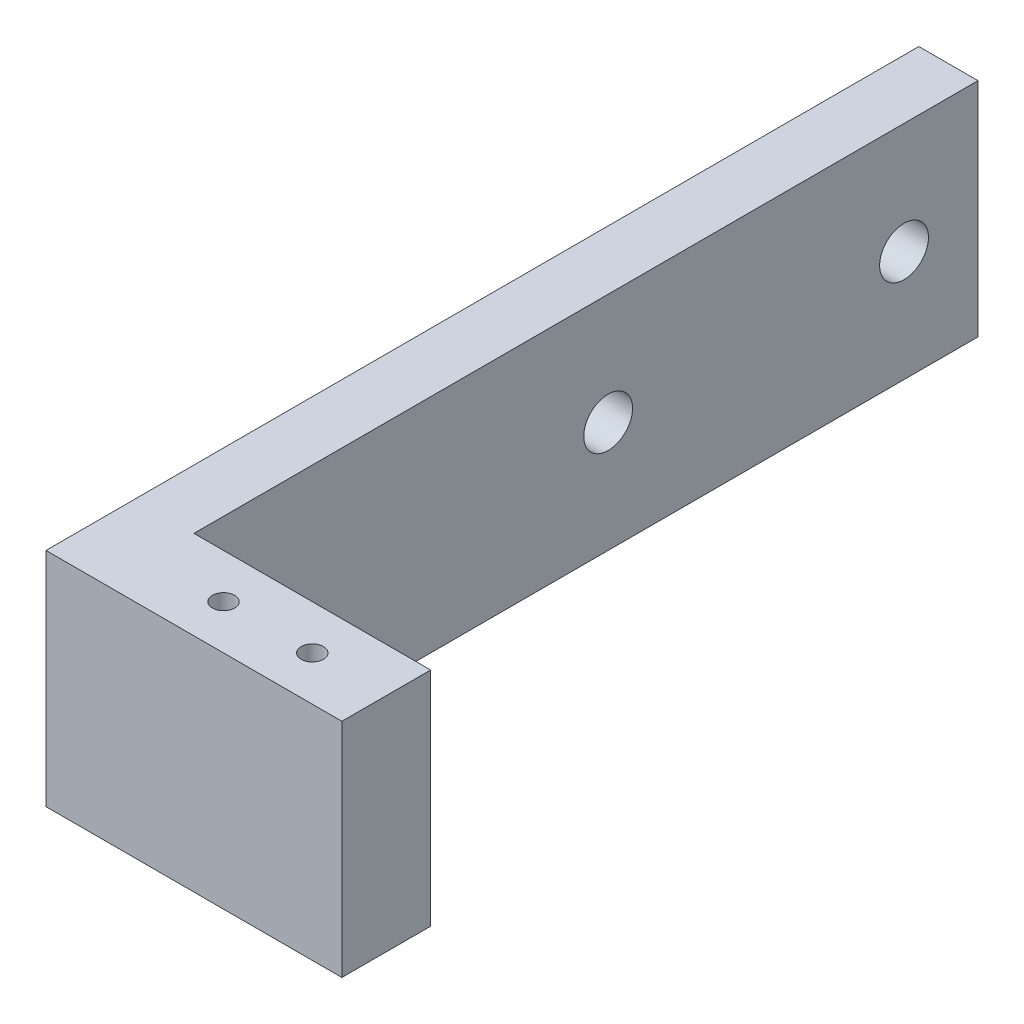
ISO-10303-21;
HEADER;
FILE_DESCRIPTION(('STEP AP214'),'2;1');
FILE_NAME('part.step','',(''),(''),'','','');
FILE_SCHEMA(('AUTOMOTIVE_DESIGN { 1 0 10303 214 1 1 1 1 }'));
ENDSEC;
DATA;
#1=APPLICATION_CONTEXT('core data for automotive mechanical design processes');
#2=APPLICATION_PROTOCOL_DEFINITION('international standard','automotive_design',2000,#1);
#3=PRODUCT_CONTEXT('',#1,'mechanical');
#4=PRODUCT('Part','Part','',(#3));
#5=PRODUCT_RELATED_PRODUCT_CATEGORY('part','',(#4));
#6=PRODUCT_DEFINITION_FORMATION('','',#4);
#7=PRODUCT_DEFINITION_CONTEXT('part definition',#1,'design');
#8=PRODUCT_DEFINITION('design','',#6,#7);
#9=PRODUCT_DEFINITION_SHAPE('','',#8);
#10=(LENGTH_UNIT() NAMED_UNIT(*) SI_UNIT(.MILLI.,.METRE.));
#11=(NAMED_UNIT(*) PLANE_ANGLE_UNIT() SI_UNIT($,.RADIAN.));
#12=(NAMED_UNIT(*) SI_UNIT($,.STERADIAN.) SOLID_ANGLE_UNIT());
#13=UNCERTAINTY_MEASURE_WITH_UNIT(LENGTH_MEASURE(1.E-05),#10,'distance_accuracy_value','');
#14=(GEOMETRIC_REPRESENTATION_CONTEXT(3) GLOBAL_UNCERTAINTY_ASSIGNED_CONTEXT((#13)) GLOBAL_UNIT_ASSIGNED_CONTEXT((#10,
#11,#12)) REPRESENTATION_CONTEXT('',''));
#15=CARTESIAN_POINT('',(0.,0.,0.));
#16=DIRECTION('',(0.,0.,1.));
#17=DIRECTION('',(1.,0.,0.));
#18=AXIS2_PLACEMENT_3D('',#15,#16,#17);
#19=CARTESIAN_POINT('',(18.0023,20.,112.));
#20=DIRECTION('',(0.,-1.,0.));
#21=DIRECTION('',(0.,0.,-1.));
#22=AXIS2_PLACEMENT_3D('',#19,#20,#21);
#23=PLANE('',#22);
#24=CARTESIAN_POINT('',(18.0023,20.,112.));
#25=DIRECTION('',(0.,-1.,0.));
#26=DIRECTION('',(0.,0.,-1.));
#27=AXIS2_PLACEMENT_3D('',#24,#25,#26);
#28=CIRCLE('',#27,1.5);
#29=CARTESIAN_POINT('',(18.0023,20.,110.5));
#30=VERTEX_POINT('',#29);
#31=EDGE_CURVE('E19',#30,#30,#28,.F.);
#32=ORIENTED_EDGE('',*,*,#31,.T.);
#33=EDGE_LOOP('',(#32));
#34=FACE_BOUND('',#33,.T.);
#35=ADVANCED_FACE('F16',(#34),#23,.F.);
#36=CARTESIAN_POINT('',(30.0023,20.,112.));
#37=DIRECTION('',(0.,-1.,0.));
#38=DIRECTION('',(0.,0.,-1.));
#39=AXIS2_PLACEMENT_3D('',#36,#37,#38);
#40=PLANE('',#39);
#41=CARTESIAN_POINT('',(30.0023,20.,112.));
#42=DIRECTION('',(0.,-1.,0.));
#43=DIRECTION('',(0.,0.,-1.));
#44=AXIS2_PLACEMENT_3D('',#41,#42,#43);
#45=CIRCLE('',#44,1.5);
#46=CARTESIAN_POINT('',(30.0023,20.,110.5));
#47=VERTEX_POINT('',#46);
#48=EDGE_CURVE('E78',#47,#47,#45,.F.);
#49=ORIENTED_EDGE('',*,*,#48,.T.);
#50=EDGE_LOOP('',(#49));
#51=FACE_BOUND('',#50,.T.);
#52=ADVANCED_FACE('F121',(#51),#40,.F.);
#53=CARTESIAN_POINT('',(18.0023,30.,112.));
#54=DIRECTION('',(0.,-1.,0.));
#55=DIRECTION('',(0.,0.,-1.));
#56=AXIS2_PLACEMENT_3D('',#53,#54,#55);
#57=CYLINDRICAL_SURFACE('',#56,1.5);
#58=CARTESIAN_POINT('',(18.0023,30.,112.));
#59=DIRECTION('',(0.,-1.,0.));
#60=DIRECTION('',(0.,0.,-1.));
#61=AXIS2_PLACEMENT_3D('',#58,#59,#60);
#62=CIRCLE('',#61,1.5);
#63=CARTESIAN_POINT('',(18.0023,30.,110.5));
#64=VERTEX_POINT('',#63);
#65=EDGE_CURVE('E109',#64,#64,#62,.T.);
#66=ORIENTED_EDGE('',*,*,#65,.F.);
#67=EDGE_LOOP('',(#66));
#68=FACE_BOUND('',#67,.T.);
#69=ORIENTED_EDGE('',*,*,#31,.F.);
#70=EDGE_LOOP('',(#69));
#71=FACE_BOUND('',#70,.T.);
#72=ADVANCED_FACE('F118',(#68,#71),#57,.F.);
#73=CARTESIAN_POINT('',(30.0023,30.,112.));
#74=DIRECTION('',(0.,-1.,0.));
#75=DIRECTION('',(0.,0.,-1.));
#76=AXIS2_PLACEMENT_3D('',#73,#74,#75);
#77=CYLINDRICAL_SURFACE('',#76,1.5);
#78=CARTESIAN_POINT('',(30.0023,30.,112.));
#79=DIRECTION('',(0.,-1.,0.));
#80=DIRECTION('',(0.,0.,-1.));
#81=AXIS2_PLACEMENT_3D('',#78,#79,#80);
#82=CIRCLE('',#81,1.5);
#83=CARTESIAN_POINT('',(30.0023,30.,110.5));
#84=VERTEX_POINT('',#83);
#85=EDGE_CURVE('E106',#84,#84,#82,.T.);
#86=ORIENTED_EDGE('',*,*,#85,.F.);
#87=EDGE_LOOP('',(#86));
#88=FACE_BOUND('',#87,.T.);
#89=ORIENTED_EDGE('',*,*,#48,.F.);
#90=EDGE_LOOP('',(#89));
#91=FACE_BOUND('',#90,.T.);
#92=ADVANCED_FACE('F120',(#88,#91),#77,.F.);
#93=CARTESIAN_POINT('',(40.0023,0.,106.));
#94=DIRECTION('',(1.,0.,0.));
#95=DIRECTION('',(0.,0.,-1.));
#96=AXIS2_PLACEMENT_3D('',#93,#94,#95);
#97=PLANE('',#96);
#98=DIRECTION('',(0.,0.,1.));
#99=VECTOR('',#98,1.);
#100=CARTESIAN_POINT('',(40.0023,30.,106.));
#101=LINE('',#100,#99);
#102=CARTESIAN_POINT('',(40.0023,30.,118.));
#103=VERTEX_POINT('',#102);
#104=CARTESIAN_POINT('',(40.0023,30.,106.));
#105=VERTEX_POINT('',#104);
#106=EDGE_CURVE('E92',#103,#105,#101,.F.);
#107=ORIENTED_EDGE('',*,*,#106,.F.);
#108=DIRECTION('',(0.,1.,0.));
#109=VECTOR('',#108,1.);
#110=CARTESIAN_POINT('',(40.0023,0.,118.));
#111=LINE('',#110,#109);
#112=CARTESIAN_POINT('',(40.0023,0.,118.));
#113=VERTEX_POINT('',#112);
#114=EDGE_CURVE('E90',#113,#103,#111,.T.);
#115=ORIENTED_EDGE('',*,*,#114,.F.);
#116=DIRECTION('',(0.,0.,1.));
#117=VECTOR('',#116,1.);
#118=CARTESIAN_POINT('',(40.0023,0.,106.));
#119=LINE('',#118,#117);
#120=CARTESIAN_POINT('',(40.0023,0.,106.));
#121=VERTEX_POINT('',#120);
#122=EDGE_CURVE('E84',#113,#121,#119,.F.);
#123=ORIENTED_EDGE('',*,*,#122,.T.);
#124=DIRECTION('',(0.,1.,0.));
#125=VECTOR('',#124,1.);
#126=CARTESIAN_POINT('',(40.0023,0.,106.));
#127=LINE('',#126,#125);
#128=EDGE_CURVE('E67',#121,#105,#127,.T.);
#129=ORIENTED_EDGE('',*,*,#128,.T.);
#130=EDGE_LOOP('',(#107,#115,#123,#129));
#131=FACE_BOUND('',#130,.T.);
#132=ADVANCED_FACE('F89',(#131),#97,.T.);
#133=CARTESIAN_POINT('',(8.0023,0.,106.));
#134=DIRECTION('',(0.,0.,1.));
#135=DIRECTION('',(1.,0.,0.));
#136=AXIS2_PLACEMENT_3D('',#133,#134,#135);
#137=PLANE('',#136);
#138=ORIENTED_EDGE('',*,*,#128,.F.);
#139=DIRECTION('',(1.,0.,0.));
#140=VECTOR('',#139,1.);
#141=CARTESIAN_POINT('',(8.0023,0.,106.));
#142=LINE('',#141,#140);
#143=CARTESIAN_POINT('',(8.0023,0.,106.));
#144=VERTEX_POINT('',#143);
#145=EDGE_CURVE('E75',#121,#144,#142,.F.);
#146=ORIENTED_EDGE('',*,*,#145,.T.);
#147=DIRECTION('',(0.,1.,0.));
#148=VECTOR('',#147,1.);
#149=CARTESIAN_POINT('',(8.0023,0.,106.));
#150=LINE('',#149,#148);
#151=CARTESIAN_POINT('',(8.0023,30.,106.));
#152=VERTEX_POINT('',#151);
#153=EDGE_CURVE('E264',#152,#144,#150,.F.);
#154=ORIENTED_EDGE('',*,*,#153,.F.);
#155=DIRECTION('',(1.,0.,0.));
#156=VECTOR('',#155,1.);
#157=CARTESIAN_POINT('',(8.0023,30.,106.));
#158=LINE('',#157,#156);
#159=EDGE_CURVE('E77',#105,#152,#158,.F.);
#160=ORIENTED_EDGE('',*,*,#159,.F.);
#161=EDGE_LOOP('',(#138,#146,#154,#160));
#162=FACE_BOUND('',#161,.T.);
#163=ADVANCED_FACE('F73',(#162),#137,.F.);
#164=CARTESIAN_POINT('',(8.0023,0.,0.));
#165=DIRECTION('',(1.,0.,0.));
#166=DIRECTION('',(0.,0.,-1.));
#167=AXIS2_PLACEMENT_3D('',#164,#165,#166);
#168=PLANE('',#167);
#169=CARTESIAN_POINT('',(8.0023,15.,50.));
#170=DIRECTION('',(1.,0.,0.));
#171=DIRECTION('',(0.,0.,-1.));
#172=AXIS2_PLACEMENT_3D('',#169,#170,#171);
#173=CIRCLE('',#172,3.3);
#174=CARTESIAN_POINT('',(8.0023,15.,46.7));
#175=VERTEX_POINT('',#174);
#176=EDGE_CURVE('E99',#175,#175,#173,.F.);
#177=ORIENTED_EDGE('',*,*,#176,.T.);
#178=EDGE_LOOP('',(#177));
#179=FACE_BOUND('',#178,.T.);
#180=CARTESIAN_POINT('',(8.0023,15.,10.));
#181=DIRECTION('',(1.,0.,0.));
#182=DIRECTION('',(0.,0.,-1.));
#183=AXIS2_PLACEMENT_3D('',#180,#181,#182);
#184=CIRCLE('',#183,3.3);
#185=CARTESIAN_POINT('',(8.0023,15.,6.7));
#186=VERTEX_POINT('',#185);
#187=EDGE_CURVE('E103',#186,#186,#184,.F.);
#188=ORIENTED_EDGE('',*,*,#187,.T.);
#189=EDGE_LOOP('',(#188));
#190=FACE_BOUND('',#189,.T.);
#191=DIRECTION('',(0.,0.,1.));
#192=VECTOR('',#191,1.);
#193=CARTESIAN_POINT('',(8.0023,30.,0.));
#194=LINE('',#193,#192);
#195=CARTESIAN_POINT('',(8.0023,30.,0.));
#196=VERTEX_POINT('',#195);
#197=EDGE_CURVE('E263',#152,#196,#194,.F.);
#198=ORIENTED_EDGE('',*,*,#197,.F.);
#199=ORIENTED_EDGE('',*,*,#153,.T.);
#200=DIRECTION('',(0.,0.,1.));
#201=VECTOR('',#200,1.);
#202=CARTESIAN_POINT('',(8.0023,0.,0.));
#203=LINE('',#202,#201);
#204=CARTESIAN_POINT('',(8.0023,0.,0.));
#205=VERTEX_POINT('',#204);
#206=EDGE_CURVE('E87',#144,#205,#203,.F.);
#207=ORIENTED_EDGE('',*,*,#206,.T.);
#208=DIRECTION('',(0.,1.,0.));
#209=VECTOR('',#208,1.);
#210=CARTESIAN_POINT('',(8.0023,0.,0.));
#211=LINE('',#210,#209);
#212=EDGE_CURVE('E266',#205,#196,#211,.T.);
#213=ORIENTED_EDGE('',*,*,#212,.T.);
#214=EDGE_LOOP('',(#198,#199,#207,#213));
#215=FACE_BOUND('',#214,.T.);
#216=ADVANCED_FACE('F162',(#179,#190,#215),#168,.T.);
#217=CARTESIAN_POINT('',(0.002299999999998,0.,0.));
#218=DIRECTION('',(0.,1.,0.));
#219=DIRECTION('',(0.,0.,1.));
#220=AXIS2_PLACEMENT_3D('',#217,#218,#219);
#221=PLANE('',#220);
#222=ORIENTED_EDGE('',*,*,#206,.F.);
#223=ORIENTED_EDGE('',*,*,#145,.F.);
#224=ORIENTED_EDGE('',*,*,#122,.F.);
#225=DIRECTION('',(1.,0.,0.));
#226=VECTOR('',#225,1.);
#227=CARTESIAN_POINT('',(0.002299999999998,0.,118.));
#228=LINE('',#227,#226);
#229=CARTESIAN_POINT('',(0.002299999999998,0.,118.));
#230=VERTEX_POINT('',#229);
#231=EDGE_CURVE('E268',#230,#113,#228,.T.);
#232=ORIENTED_EDGE('',*,*,#231,.F.);
#233=DIRECTION('',(0.,0.,-1.));
#234=VECTOR('',#233,1.);
#235=CARTESIAN_POINT('',(0.002299999999998,0.,0.));
#236=LINE('',#235,#234);
#237=CARTESIAN_POINT('',(0.002299999999998,0.,0.));
#238=VERTEX_POINT('',#237);
#239=EDGE_CURVE('E102',#230,#238,#236,.T.);
#240=ORIENTED_EDGE('',*,*,#239,.T.);
#241=DIRECTION('',(1.,0.,0.));
#242=VECTOR('',#241,1.);
#243=CARTESIAN_POINT('',(0.002299999999998,0.,0.));
#244=LINE('',#243,#242);
#245=EDGE_CURVE('E276',#238,#205,#244,.T.);
#246=ORIENTED_EDGE('',*,*,#245,.T.);
#247=EDGE_LOOP('',(#222,#223,#224,#232,#240,#246));
#248=FACE_BOUND('',#247,.T.);
#249=ADVANCED_FACE('F82',(#248),#221,.F.);
#250=CARTESIAN_POINT('',(0.002299999999998,0.,0.));
#251=DIRECTION('',(0.,0.,1.));
#252=DIRECTION('',(1.,0.,0.));
#253=AXIS2_PLACEMENT_3D('',#250,#251,#252);
#254=PLANE('',#253);
#255=ORIENTED_EDGE('',*,*,#212,.F.);
#256=ORIENTED_EDGE('',*,*,#245,.F.);
#257=DIRECTION('',(0.,1.,0.));
#258=VECTOR('',#257,1.);
#259=CARTESIAN_POINT('',(0.002299999999998,0.,0.));
#260=LINE('',#259,#258);
#261=CARTESIAN_POINT('',(0.002299999999998,30.,0.));
#262=VERTEX_POINT('',#261);
#263=EDGE_CURVE('E287',#238,#262,#260,.T.);
#264=ORIENTED_EDGE('',*,*,#263,.T.);
#265=DIRECTION('',(1.,0.,0.));
#266=VECTOR('',#265,1.);
#267=CARTESIAN_POINT('',(0.002299999999998,30.,0.));
#268=LINE('',#267,#266);
#269=EDGE_CURVE('E269',#196,#262,#268,.F.);
#270=ORIENTED_EDGE('',*,*,#269,.F.);
#271=EDGE_LOOP('',(#255,#256,#264,#270));
#272=FACE_BOUND('',#271,.T.);
#273=ADVANCED_FACE('F155',(#272),#254,.F.);
#274=CARTESIAN_POINT('',(0.002299999999998,30.,0.));
#275=DIRECTION('',(0.,1.,0.));
#276=DIRECTION('',(0.,0.,1.));
#277=AXIS2_PLACEMENT_3D('',#274,#275,#276);
#278=PLANE('',#277);
#279=DIRECTION('',(1.,0.,0.));
#280=VECTOR('',#279,1.);
#281=CARTESIAN_POINT('',(0.002299999999998,30.,118.));
#282=LINE('',#281,#280);
#283=CARTESIAN_POINT('',(0.002299999999998,30.,118.));
#284=VERTEX_POINT('',#283);
#285=EDGE_CURVE('E34',#103,#284,#282,.F.);
#286=ORIENTED_EDGE('',*,*,#285,.F.);
#287=ORIENTED_EDGE('',*,*,#106,.T.);
#288=ORIENTED_EDGE('',*,*,#159,.T.);
#289=ORIENTED_EDGE('',*,*,#197,.T.);
#290=ORIENTED_EDGE('',*,*,#269,.T.);
#291=DIRECTION('',(0.,0.,-1.));
#292=VECTOR('',#291,1.);
#293=CARTESIAN_POINT('',(0.002299999999998,30.,0.));
#294=LINE('',#293,#292);
#295=EDGE_CURVE('E283',#262,#284,#294,.F.);
#296=ORIENTED_EDGE('',*,*,#295,.T.);
#297=EDGE_LOOP('',(#286,#287,#288,#289,#290,#296));
#298=FACE_BOUND('',#297,.T.);
#299=ORIENTED_EDGE('',*,*,#85,.T.);
#300=EDGE_LOOP('',(#299));
#301=FACE_BOUND('',#300,.T.);
#302=ORIENTED_EDGE('',*,*,#65,.T.);
#303=EDGE_LOOP('',(#302));
#304=FACE_BOUND('',#303,.T.);
#305=ADVANCED_FACE('F152',(#298,#301,#304),#278,.T.);
#306=CARTESIAN_POINT('',(0.002299999999998,0.,118.));
#307=DIRECTION('',(0.,0.,1.));
#308=DIRECTION('',(1.,0.,0.));
#309=AXIS2_PLACEMENT_3D('',#306,#307,#308);
#310=PLANE('',#309);
#311=ORIENTED_EDGE('',*,*,#231,.T.);
#312=ORIENTED_EDGE('',*,*,#114,.T.);
#313=ORIENTED_EDGE('',*,*,#285,.T.);
#314=DIRECTION('',(0.,1.,0.));
#315=VECTOR('',#314,1.);
#316=CARTESIAN_POINT('',(0.002299999999998,0.,118.));
#317=LINE('',#316,#315);
#318=EDGE_CURVE('E98',#284,#230,#317,.F.);
#319=ORIENTED_EDGE('',*,*,#318,.T.);
#320=EDGE_LOOP('',(#311,#312,#313,#319));
#321=FACE_BOUND('',#320,.T.);
#322=ADVANCED_FACE('F148',(#321),#310,.T.);
#323=CARTESIAN_POINT('',(0.002299999999998,15.,10.));
#324=DIRECTION('',(1.,0.,0.));
#325=DIRECTION('',(0.,0.,-1.));
#326=AXIS2_PLACEMENT_3D('',#323,#324,#325);
#327=CYLINDRICAL_SURFACE('',#326,3.3);
#328=CARTESIAN_POINT('',(0.002299999999998,15.,10.));
#329=DIRECTION('',(1.,0.,0.));
#330=DIRECTION('',(0.,0.,-1.));
#331=AXIS2_PLACEMENT_3D('',#328,#329,#330);
#332=CIRCLE('',#331,3.3);
#333=CARTESIAN_POINT('',(0.002299999999998,15.,6.7));
#334=VERTEX_POINT('',#333);
#335=EDGE_CURVE('E25',#334,#334,#332,.F.);
#336=ORIENTED_EDGE('',*,*,#335,.T.);
#337=EDGE_LOOP('',(#336));
#338=FACE_BOUND('',#337,.T.);
#339=ORIENTED_EDGE('',*,*,#187,.F.);
#340=EDGE_LOOP('',(#339));
#341=FACE_BOUND('',#340,.T.);
#342=ADVANCED_FACE('F140',(#338,#341),#327,.F.);
#343=CARTESIAN_POINT('',(0.002299999999998,15.,50.));
#344=DIRECTION('',(1.,0.,0.));
#345=DIRECTION('',(0.,0.,-1.));
#346=AXIS2_PLACEMENT_3D('',#343,#344,#345);
#347=CYLINDRICAL_SURFACE('',#346,3.3);
#348=CARTESIAN_POINT('',(0.002299999999998,15.,50.));
#349=DIRECTION('',(1.,0.,0.));
#350=DIRECTION('',(0.,0.,-1.));
#351=AXIS2_PLACEMENT_3D('',#348,#349,#350);
#352=CIRCLE('',#351,3.3);
#353=CARTESIAN_POINT('',(0.002299999999998,15.,46.7));
#354=VERTEX_POINT('',#353);
#355=EDGE_CURVE('E11',#354,#354,#352,.F.);
#356=ORIENTED_EDGE('',*,*,#355,.T.);
#357=EDGE_LOOP('',(#356));
#358=FACE_BOUND('',#357,.T.);
#359=ORIENTED_EDGE('',*,*,#176,.F.);
#360=EDGE_LOOP('',(#359));
#361=FACE_BOUND('',#360,.T.);
#362=ADVANCED_FACE('F134',(#358,#361),#347,.F.);
#363=CARTESIAN_POINT('',(0.002299999999998,0.,0.));
#364=DIRECTION('',(1.,0.,0.));
#365=DIRECTION('',(0.,0.,-1.));
#366=AXIS2_PLACEMENT_3D('',#363,#364,#365);
#367=PLANE('',#366);
#368=ORIENTED_EDGE('',*,*,#355,.F.);
#369=EDGE_LOOP('',(#368));
#370=FACE_BOUND('',#369,.T.);
#371=ORIENTED_EDGE('',*,*,#335,.F.);
#372=EDGE_LOOP('',(#371));
#373=FACE_BOUND('',#372,.T.);
#374=ORIENTED_EDGE('',*,*,#295,.F.);
#375=ORIENTED_EDGE('',*,*,#263,.F.);
#376=ORIENTED_EDGE('',*,*,#239,.F.);
#377=ORIENTED_EDGE('',*,*,#318,.F.);
#378=EDGE_LOOP('',(#374,#375,#376,#377));
#379=FACE_BOUND('',#378,.T.);
#380=ADVANCED_FACE('F132',(#370,#373,#379),#367,.F.);
#381=CLOSED_SHELL('',(#35,#52,#72,#92,#132,#163,#216,#249,#273,#305,#322,#342,#362,#380));
#382=MANIFOLD_SOLID_BREP('B1',#381);
#383=ADVANCED_BREP_SHAPE_REPRESENTATION('',(#18,#382),#14);
#384=SHAPE_DEFINITION_REPRESENTATION(#9,#383);
ENDSEC;
END-ISO-10303-21;
